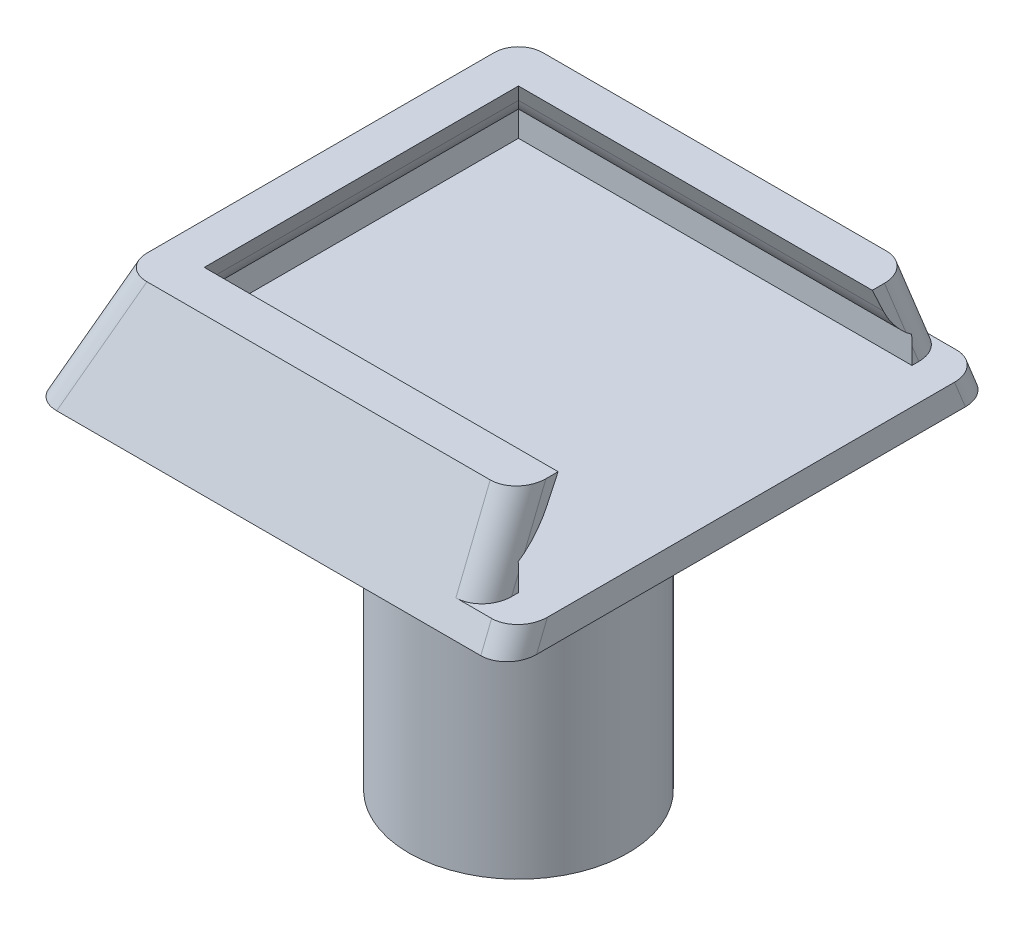
ISO-10303-21;
HEADER;
FILE_DESCRIPTION(('STEP AP214'),'2;1');
FILE_NAME('part.step','',(''),(''),'','','');
FILE_SCHEMA(('AUTOMOTIVE_DESIGN { 1 0 10303 214 1 1 1 1 }'));
ENDSEC;
DATA;
#1=APPLICATION_CONTEXT('core data for automotive mechanical design processes');
#2=APPLICATION_PROTOCOL_DEFINITION('international standard','automotive_design',2000,#1);
#3=PRODUCT_CONTEXT('',#1,'mechanical');
#4=PRODUCT('Part','Part','',(#3));
#5=PRODUCT_RELATED_PRODUCT_CATEGORY('part','',(#4));
#6=PRODUCT_DEFINITION_FORMATION('','',#4);
#7=PRODUCT_DEFINITION_CONTEXT('part definition',#1,'design');
#8=PRODUCT_DEFINITION('design','',#6,#7);
#9=PRODUCT_DEFINITION_SHAPE('','',#8);
#10=(LENGTH_UNIT() NAMED_UNIT(*) SI_UNIT(.MILLI.,.METRE.));
#11=(NAMED_UNIT(*) PLANE_ANGLE_UNIT() SI_UNIT($,.RADIAN.));
#12=(NAMED_UNIT(*) SI_UNIT($,.STERADIAN.) SOLID_ANGLE_UNIT());
#13=UNCERTAINTY_MEASURE_WITH_UNIT(LENGTH_MEASURE(1.E-05),#10,'distance_accuracy_value','');
#14=(GEOMETRIC_REPRESENTATION_CONTEXT(3) GLOBAL_UNCERTAINTY_ASSIGNED_CONTEXT((#13)) GLOBAL_UNIT_ASSIGNED_CONTEXT((#10,
#11,#12)) REPRESENTATION_CONTEXT('',''));
#15=CARTESIAN_POINT('',(0.,0.,0.));
#16=DIRECTION('',(0.,0.,1.));
#17=DIRECTION('',(1.,0.,0.));
#18=AXIS2_PLACEMENT_3D('',#15,#16,#17);
#19=CARTESIAN_POINT('',(48.,12.5,-4.));
#20=DIRECTION('',(-1.,0.,0.));
#21=DIRECTION('',(0.,0.,1.));
#22=AXIS2_PLACEMENT_3D('',#19,#20,#21);
#23=PLANE('',#22);
#24=DIRECTION('',(0.,0.,-1.));
#25=VECTOR('',#24,1.);
#26=CARTESIAN_POINT('',(48.,3.,-4.));
#27=LINE('',#26,#25);
#28=CARTESIAN_POINT('',(48.,3.,-3.23560422803275));
#29=VERTEX_POINT('',#28);
#30=CARTESIAN_POINT('',(48.,3.,-4.));
#31=VERTEX_POINT('',#30);
#32=EDGE_CURVE('E202',#29,#31,#27,.T.);
#33=ORIENTED_EDGE('',*,*,#32,.T.);
#34=DIRECTION('',(0.,1.,0.));
#35=VECTOR('',#34,1.);
#36=CARTESIAN_POINT('',(48.,12.5,-4.));
#37=LINE('',#36,#35);
#38=CARTESIAN_POINT('',(48.,4.89194592600314,-4.));
#39=VERTEX_POINT('',#38);
#40=EDGE_CURVE('E196',#31,#39,#37,.T.);
#41=ORIENTED_EDGE('',*,*,#40,.T.);
#42=DIRECTION('',(0.,0.927183854566787,-0.374606593415913));
#43=VECTOR('',#42,1.);
#44=CARTESIAN_POINT('',(48.,11.4323610122788,-6.64249922270331));
#45=LINE('',#44,#43);
#46=EDGE_CURVE('E312',#39,#29,#45,.F.);
#47=ORIENTED_EDGE('',*,*,#46,.T.);
#48=EDGE_LOOP('',(#33,#41,#47));
#49=FACE_BOUND('',#48,.T.);
#50=ADVANCED_FACE('F39',(#49),#23,.F.);
#51=CARTESIAN_POINT('',(48.,12.5,-52.));
#52=DIRECTION('',(-1.,0.,0.));
#53=DIRECTION('',(0.,0.,1.));
#54=AXIS2_PLACEMENT_3D('',#51,#52,#53);
#55=PLANE('',#54);
#56=DIRECTION('',(0.,0.90630778703665,0.4226182617407));
#57=VECTOR('',#56,1.);
#58=CARTESIAN_POINT('',(48.,9.2711522597731,-45.0757136758118));
#59=LINE('',#58,#57);
#60=CARTESIAN_POINT('',(48.,12.5,-43.5700772475275));
#61=VERTEX_POINT('',#60);
#62=CARTESIAN_POINT('',(48.,9.88094574156506,-44.7913623053592));
#63=VERTEX_POINT('',#62);
#64=EDGE_CURVE('E251',#61,#63,#59,.F.);
#65=ORIENTED_EDGE('',*,*,#64,.T.);
#66=CARTESIAN_POINT('',(48.,14.1071283589721,-53.8544401757257));
#67=DIRECTION('',(-1.,0.,0.));
#68=DIRECTION('',(0.,0.,1.));
#69=AXIS2_PLACEMENT_3D('',#66,#67,#68);
#70=CIRCLE('',#69,10.);
#71=CARTESIAN_POINT('',(48.,6.51732564207658,-47.3433039677658));
#72=VERTEX_POINT('',#71);
#73=EDGE_CURVE('E352',#63,#72,#70,.F.);
#74=ORIENTED_EDGE('',*,*,#73,.T.);
#75=DIRECTION('',(0.,0.927183854566787,0.374606593415913));
#76=VECTOR('',#75,1.);
#77=CARTESIAN_POINT('',(48.,10.0430442713609,-45.9188211766194));
#78=LINE('',#77,#76);
#79=CARTESIAN_POINT('',(48.,12.5,-44.9261466265332));
#80=VERTEX_POINT('',#79);
#81=EDGE_CURVE('E308',#72,#80,#78,.T.);
#82=ORIENTED_EDGE('',*,*,#81,.T.);
#83=DIRECTION('',(0.,0.,-1.));
#84=VECTOR('',#83,1.);
#85=CARTESIAN_POINT('',(48.,12.5,-52.));
#86=LINE('',#85,#84);
#87=EDGE_CURVE('E252',#61,#80,#86,.T.);
#88=ORIENTED_EDGE('',*,*,#87,.F.);
#89=EDGE_LOOP('',(#65,#74,#82,#88));
#90=FACE_BOUND('',#89,.T.);
#91=ADVANCED_FACE('F384',(#90),#55,.F.);
#92=CARTESIAN_POINT('',(0.,3.,0.));
#93=DIRECTION('',(0.,-1.,0.));
#94=DIRECTION('',(0.,0.,-1.));
#95=AXIS2_PLACEMENT_3D('',#92,#93,#94);
#96=PLANE('',#95);
#97=DIRECTION('',(0.,0.,-1.));
#98=VECTOR('',#97,1.);
#99=CARTESIAN_POINT('',(48.,3.,-52.));
#100=LINE('',#99,#98);
#101=CARTESIAN_POINT('',(48.,3.,-48.));
#102=VERTEX_POINT('',#101);
#103=CARTESIAN_POINT('',(48.,3.,-48.7643957719673));
#104=VERTEX_POINT('',#103);
#105=EDGE_CURVE('E218',#102,#104,#100,.T.);
#106=ORIENTED_EDGE('',*,*,#105,.F.);
#107=DIRECTION('',(1.,0.,0.));
#108=VECTOR('',#107,1.);
#109=CARTESIAN_POINT('',(4.,3.,-48.));
#110=LINE('',#109,#108);
#111=CARTESIAN_POINT('',(4.,3.,-48.));
#112=VERTEX_POINT('',#111);
#113=EDGE_CURVE('E216',#112,#102,#110,.T.);
#114=ORIENTED_EDGE('',*,*,#113,.F.);
#115=DIRECTION('',(0.,0.,-1.));
#116=VECTOR('',#115,1.);
#117=CARTESIAN_POINT('',(4.,3.,-48.));
#118=LINE('',#117,#116);
#119=CARTESIAN_POINT('',(4.,3.,-4.));
#120=VERTEX_POINT('',#119);
#121=EDGE_CURVE('E201',#120,#112,#118,.T.);
#122=ORIENTED_EDGE('',*,*,#121,.F.);
#123=DIRECTION('',(-1.,0.,0.));
#124=VECTOR('',#123,1.);
#125=CARTESIAN_POINT('',(4.,3.,-4.));
#126=LINE('',#125,#124);
#127=EDGE_CURVE('E190',#31,#120,#126,.T.);
#128=ORIENTED_EDGE('',*,*,#127,.F.);
#129=ORIENTED_EDGE('',*,*,#32,.F.);
#130=CARTESIAN_POINT('',(45.,3.,-3.23560422803275));
#131=DIRECTION('',(0.,-1.,0.));
#132=DIRECTION('',(0.,0.,-1.));
#133=AXIS2_PLACEMENT_3D('',#130,#131,#132);
#134=ELLIPSE('',#133,3.23560422803275,3.);
#135=CARTESIAN_POINT('',(45.,3.,0.));
#136=VERTEX_POINT('',#135);
#137=EDGE_CURVE('E322',#29,#136,#134,.T.);
#138=ORIENTED_EDGE('',*,*,#137,.T.);
#139=DIRECTION('',(-1.,0.,0.));
#140=VECTOR('',#139,1.);
#141=CARTESIAN_POINT('',(0.,3.,0.));
#142=LINE('',#141,#140);
#143=CARTESIAN_POINT('',(49.,3.,0.));
#144=VERTEX_POINT('',#143);
#145=EDGE_CURVE('E236',#136,#144,#142,.F.);
#146=ORIENTED_EDGE('',*,*,#145,.T.);
#147=CARTESIAN_POINT('',(49.,3.,-3.23560422803275));
#148=DIRECTION('',(0.,-1.,0.));
#149=DIRECTION('',(0.,0.,-1.));
#150=AXIS2_PLACEMENT_3D('',#147,#148,#149);
#151=ELLIPSE('',#150,3.23560422803275,3.);
#152=CARTESIAN_POINT('',(52.,3.,-3.23560422803275));
#153=VERTEX_POINT('',#152);
#154=EDGE_CURVE('E338',#144,#153,#151,.F.);
#155=ORIENTED_EDGE('',*,*,#154,.T.);
#156=DIRECTION('',(0.,0.,-1.));
#157=VECTOR('',#156,1.);
#158=CARTESIAN_POINT('',(52.,3.,0.));
#159=LINE('',#158,#157);
#160=CARTESIAN_POINT('',(52.,3.,-48.7643957719672));
#161=VERTEX_POINT('',#160);
#162=EDGE_CURVE('E233',#153,#161,#159,.T.);
#163=ORIENTED_EDGE('',*,*,#162,.T.);
#164=CARTESIAN_POINT('',(49.,3.,-48.7643957719672));
#165=DIRECTION('',(0.,-1.,0.));
#166=DIRECTION('',(0.,0.,1.));
#167=AXIS2_PLACEMENT_3D('',#164,#165,#166);
#168=ELLIPSE('',#167,3.23560422803275,3.);
#169=CARTESIAN_POINT('',(49.,3.,-52.));
#170=VERTEX_POINT('',#169);
#171=EDGE_CURVE('E340',#161,#170,#168,.F.);
#172=ORIENTED_EDGE('',*,*,#171,.T.);
#173=DIRECTION('',(1.,0.,0.));
#174=VECTOR('',#173,1.);
#175=CARTESIAN_POINT('',(0.,3.,-52.));
#176=LINE('',#175,#174);
#177=CARTESIAN_POINT('',(45.,3.,-52.));
#178=VERTEX_POINT('',#177);
#179=EDGE_CURVE('E235',#170,#178,#176,.F.);
#180=ORIENTED_EDGE('',*,*,#179,.T.);
#181=CARTESIAN_POINT('',(45.,3.,-48.7643957719673));
#182=DIRECTION('',(0.,-1.,0.));
#183=DIRECTION('',(0.,0.,1.));
#184=AXIS2_PLACEMENT_3D('',#181,#182,#183);
#185=ELLIPSE('',#184,3.23560422803275,3.);
#186=EDGE_CURVE('E320',#178,#104,#185,.T.);
#187=ORIENTED_EDGE('',*,*,#186,.T.);
#188=EDGE_LOOP('',(#106,#114,#122,#128,#129,#138,#146,#155,#163,#172,#180,#187));
#189=FACE_BOUND('',#188,.T.);
#190=ADVANCED_FACE('F215',(#189),#96,.F.);
#191=CARTESIAN_POINT('',(0.,3.,0.));
#192=DIRECTION('',(-0.927183854566787,0.374606593415913,0.));
#193=DIRECTION('',(-0.374606593415913,-0.927183854566787,0.));
#194=AXIS2_PLACEMENT_3D('',#191,#192,#193);
#195=PLANE('',#194);
#196=DIRECTION('',(0.,0.,-1.));
#197=VECTOR('',#196,1.);
#198=CARTESIAN_POINT('',(3.838249145434,12.5,0.));
#199=LINE('',#198,#197);
#200=CARTESIAN_POINT('',(3.838249145434,12.5,-45.3801992908656));
#201=VERTEX_POINT('',#200);
#202=CARTESIAN_POINT('',(3.838249145434,12.5,-6.61980070913436));
#203=VERTEX_POINT('',#202);
#204=EDGE_CURVE('E224',#201,#203,#199,.F.);
#205=ORIENTED_EDGE('',*,*,#204,.F.);
#206=DIRECTION('',(0.350800434887317,0.868261544562316,0.350800434887317));
#207=VECTOR('',#206,1.);
#208=CARTESIAN_POINT('',(6.05686878176981,17.991276294626,-43.1615796545298));
#209=LINE('',#208,#207);
#210=CARTESIAN_POINT('',(-1.21207867750547,0.,-50.4305271138051));
#211=VERTEX_POINT('',#210);
#212=EDGE_CURVE('E287',#201,#211,#209,.F.);
#213=ORIENTED_EDGE('',*,*,#212,.T.);
#214=DIRECTION('',(0.,0.,-1.));
#215=VECTOR('',#214,1.);
#216=CARTESIAN_POINT('',(-1.21207867750547,0.,0.));
#217=LINE('',#216,#215);
#218=CARTESIAN_POINT('',(-1.21207867750547,0.,-1.56947288619489));
#219=VERTEX_POINT('',#218);
#220=EDGE_CURVE('E232',#211,#219,#217,.F.);
#221=ORIENTED_EDGE('',*,*,#220,.T.);
#222=DIRECTION('',(0.350800434887317,0.868261544562316,-0.350800434887317));
#223=VECTOR('',#222,1.);
#224=CARTESIAN_POINT('',(-0.342300364321,2.15277686834949,-2.43925119937936));
#225=LINE('',#224,#223);
#226=EDGE_CURVE('E285',#219,#203,#225,.T.);
#227=ORIENTED_EDGE('',*,*,#226,.T.);
#228=EDGE_LOOP('',(#205,#213,#221,#227));
#229=FACE_BOUND('',#228,.T.);
#230=ADVANCED_FACE('F512',(#229),#195,.T.);
#231=CARTESIAN_POINT('',(0.,3.,0.));
#232=DIRECTION('',(0.,0.374606593415913,0.927183854566787));
#233=DIRECTION('',(0.,-0.927183854566787,0.374606593415913));
#234=AXIS2_PLACEMENT_3D('',#231,#232,#233);
#235=PLANE('',#234);
#236=DIRECTION('',(-1.,0.,0.));
#237=VECTOR('',#236,1.);
#238=CARTESIAN_POINT('',(0.,0.,1.21207867750547));
#239=LINE('',#238,#237);
#240=CARTESIAN_POINT('',(1.56947288619489,0.,1.21207867750547));
#241=VERTEX_POINT('',#240);
#242=CARTESIAN_POINT('',(49.,0.,1.21207867750547));
#243=VERTEX_POINT('',#242);
#244=EDGE_CURVE('E241',#241,#243,#239,.F.);
#245=ORIENTED_EDGE('',*,*,#244,.T.);
#246=DIRECTION('',(0.,-0.927183854566787,0.374606593415913));
#247=VECTOR('',#246,1.);
#248=CARTESIAN_POINT('',(49.,3.,0.));
#249=LINE('',#248,#247);
#250=EDGE_CURVE('E342',#243,#144,#249,.F.);
#251=ORIENTED_EDGE('',*,*,#250,.T.);
#252=ORIENTED_EDGE('',*,*,#145,.F.);
#253=DIRECTION('',(0.,-0.927183854566787,0.374606593415913));
#254=VECTOR('',#253,1.);
#255=CARTESIAN_POINT('',(45.,3.,0.));
#256=LINE('',#255,#254);
#257=CARTESIAN_POINT('',(45.,12.5,-3.838249145434));
#258=VERTEX_POINT('',#257);
#259=EDGE_CURVE('E318',#136,#258,#256,.F.);
#260=ORIENTED_EDGE('',*,*,#259,.T.);
#261=DIRECTION('',(-1.,0.,0.));
#262=VECTOR('',#261,1.);
#263=CARTESIAN_POINT('',(0.,12.5,-3.838249145434));
#264=LINE('',#263,#262);
#265=CARTESIAN_POINT('',(6.61980070913436,12.5,-3.838249145434));
#266=VERTEX_POINT('',#265);
#267=EDGE_CURVE('E255',#266,#258,#264,.F.);
#268=ORIENTED_EDGE('',*,*,#267,.F.);
#269=DIRECTION('',(0.350800434887317,0.868261544562316,-0.350800434887317));
#270=VECTOR('',#269,1.);
#271=CARTESIAN_POINT('',(2.43925119937936,2.15277686834949,0.342300364321));
#272=LINE('',#271,#270);
#273=EDGE_CURVE('E315',#266,#241,#272,.F.);
#274=ORIENTED_EDGE('',*,*,#273,.T.);
#275=EDGE_LOOP('',(#245,#251,#252,#260,#268,#274));
#276=FACE_BOUND('',#275,.T.);
#277=ADVANCED_FACE('F494',(#276),#235,.T.);
#278=CARTESIAN_POINT('',(52.,3.,0.));
#279=DIRECTION('',(-1.,0.,0.));
#280=DIRECTION('',(0.,0.,1.));
#281=AXIS2_PLACEMENT_3D('',#278,#279,#280);
#282=PLANE('',#281);
#283=DIRECTION('',(0.,0.,-1.));
#284=VECTOR('',#283,1.);
#285=CARTESIAN_POINT('',(52.,0.,0.));
#286=LINE('',#285,#284);
#287=CARTESIAN_POINT('',(52.,0.,-2.02352555052728));
#288=VERTEX_POINT('',#287);
#289=CARTESIAN_POINT('',(52.,0.,-49.9764744494727));
#290=VERTEX_POINT('',#289);
#291=EDGE_CURVE('E237',#288,#290,#286,.T.);
#292=ORIENTED_EDGE('',*,*,#291,.T.);
#293=DIRECTION('',(0.,0.927183854566787,0.374606593415913));
#294=VECTOR('',#293,1.);
#295=CARTESIAN_POINT('',(52.,19.9372978516862,-41.9212832451045));
#296=LINE('',#295,#294);
#297=EDGE_CURVE('E335',#290,#161,#296,.T.);
#298=ORIENTED_EDGE('',*,*,#297,.T.);
#299=ORIENTED_EDGE('',*,*,#162,.F.);
#300=DIRECTION('',(0.,0.927183854566787,-0.374606593415913));
#301=VECTOR('',#300,1.);
#302=CARTESIAN_POINT('',(52.,1.87618021975226,-2.78155156370036));
#303=LINE('',#302,#301);
#304=EDGE_CURVE('E332',#153,#288,#303,.F.);
#305=ORIENTED_EDGE('',*,*,#304,.T.);
#306=EDGE_LOOP('',(#292,#298,#299,#305));
#307=FACE_BOUND('',#306,.T.);
#308=ADVANCED_FACE('F528',(#307),#282,.F.);
#309=CARTESIAN_POINT('',(0.,3.,-52.));
#310=DIRECTION('',(0.,0.374606593415913,-0.927183854566787));
#311=DIRECTION('',(0.,0.927183854566787,0.374606593415913));
#312=AXIS2_PLACEMENT_3D('',#309,#310,#311);
#313=PLANE('',#312);
#314=ORIENTED_EDGE('',*,*,#179,.F.);
#315=DIRECTION('',(0.,-0.927183854566787,-0.374606593415913));
#316=VECTOR('',#315,1.);
#317=CARTESIAN_POINT('',(49.,3.,-52.));
#318=LINE('',#317,#316);
#319=CARTESIAN_POINT('',(49.,0.,-53.2120786775055));
#320=VERTEX_POINT('',#319);
#321=EDGE_CURVE('E325',#170,#320,#318,.T.);
#322=ORIENTED_EDGE('',*,*,#321,.T.);
#323=DIRECTION('',(1.,0.,0.));
#324=VECTOR('',#323,1.);
#325=CARTESIAN_POINT('',(0.,0.,-53.2120786775055));
#326=LINE('',#325,#324);
#327=CARTESIAN_POINT('',(1.56947288619489,0.,-53.2120786775055));
#328=VERTEX_POINT('',#327);
#329=EDGE_CURVE('E240',#320,#328,#326,.F.);
#330=ORIENTED_EDGE('',*,*,#329,.T.);
#331=DIRECTION('',(0.350800434887317,0.868261544562316,0.350800434887317));
#332=VECTOR('',#331,1.);
#333=CARTESIAN_POINT('',(2.43925119937936,2.15277686834949,-52.342300364321));
#334=LINE('',#333,#332);
#335=CARTESIAN_POINT('',(6.61980070913436,12.5,-48.161750854566));
#336=VERTEX_POINT('',#335);
#337=EDGE_CURVE('E298',#328,#336,#334,.T.);
#338=ORIENTED_EDGE('',*,*,#337,.T.);
#339=DIRECTION('',(1.,0.,0.));
#340=VECTOR('',#339,1.);
#341=CARTESIAN_POINT('',(0.,12.5,-48.161750854566));
#342=LINE('',#341,#340);
#343=CARTESIAN_POINT('',(45.,12.5,-48.161750854566));
#344=VERTEX_POINT('',#343);
#345=EDGE_CURVE('E248',#344,#336,#342,.F.);
#346=ORIENTED_EDGE('',*,*,#345,.F.);
#347=DIRECTION('',(0.,-0.927183854566787,-0.374606593415913));
#348=VECTOR('',#347,1.);
#349=CARTESIAN_POINT('',(45.,2.99999999999997,-52.));
#350=LINE('',#349,#348);
#351=EDGE_CURVE('E295',#344,#178,#350,.T.);
#352=ORIENTED_EDGE('',*,*,#351,.T.);
#353=EDGE_LOOP('',(#314,#322,#330,#338,#346,#352));
#354=FACE_BOUND('',#353,.T.);
#355=ADVANCED_FACE('F445',(#354),#313,.T.);
#356=CARTESIAN_POINT('',(0.,0.,0.));
#357=DIRECTION('',(0.,-1.,0.));
#358=DIRECTION('',(0.,0.,-1.));
#359=AXIS2_PLACEMENT_3D('',#356,#357,#358);
#360=PLANE('',#359);
#361=CARTESIAN_POINT('',(26.,0.,-26.));
#362=DIRECTION('',(0.,-1.,0.));
#363=DIRECTION('',(0.,0.,-1.));
#364=AXIS2_PLACEMENT_3D('',#361,#362,#363);
#365=CIRCLE('',#364,14.25);
#366=CARTESIAN_POINT('',(26.,0.,-40.25));
#367=VERTEX_POINT('',#366);
#368=EDGE_CURVE('E282',#367,#367,#365,.F.);
#369=ORIENTED_EDGE('',*,*,#368,.T.);
#370=EDGE_LOOP('',(#369));
#371=FACE_BOUND('',#370,.T.);
#372=ORIENTED_EDGE('',*,*,#329,.F.);
#373=CARTESIAN_POINT('',(49.,0.,-49.9764744494727));
#374=DIRECTION('',(0.,-1.,0.));
#375=DIRECTION('',(0.,0.,1.));
#376=AXIS2_PLACEMENT_3D('',#373,#374,#375);
#377=ELLIPSE('',#376,3.23560422803275,3.);
#378=EDGE_CURVE('E330',#320,#290,#377,.T.);
#379=ORIENTED_EDGE('',*,*,#378,.T.);
#380=ORIENTED_EDGE('',*,*,#291,.F.);
#381=CARTESIAN_POINT('',(49.,0.,-2.02352555052728));
#382=DIRECTION('',(0.,-1.,0.));
#383=DIRECTION('',(0.,0.,-1.));
#384=AXIS2_PLACEMENT_3D('',#381,#382,#383);
#385=ELLIPSE('',#384,3.23560422803275,3.);
#386=EDGE_CURVE('E328',#288,#243,#385,.T.);
#387=ORIENTED_EDGE('',*,*,#386,.T.);
#388=ORIENTED_EDGE('',*,*,#244,.F.);
#389=CARTESIAN_POINT('',(2.02352555052728,0.,-2.02352555052728));
#390=DIRECTION('',(0.,-1.,0.));
#391=DIRECTION('',(-0.707106781186548,0.,0.707106781186548));
#392=AXIS2_PLACEMENT_3D('',#389,#390,#391);
#393=ELLIPSE('',#392,3.45518008806008,3.);
#394=EDGE_CURVE('E290',#241,#219,#393,.T.);
#395=ORIENTED_EDGE('',*,*,#394,.T.);
#396=ORIENTED_EDGE('',*,*,#220,.F.);
#397=CARTESIAN_POINT('',(2.02352555052728,0.,-49.9764744494727));
#398=DIRECTION('',(0.,-1.,0.));
#399=DIRECTION('',(-0.707106781186548,0.,-0.707106781186548));
#400=AXIS2_PLACEMENT_3D('',#397,#398,#399);
#401=ELLIPSE('',#400,3.45518008806008,3.);
#402=EDGE_CURVE('E292',#211,#328,#401,.T.);
#403=ORIENTED_EDGE('',*,*,#402,.T.);
#404=EDGE_LOOP('',(#372,#379,#380,#387,#388,#395,#396,#403));
#405=FACE_BOUND('',#404,.T.);
#406=ADVANCED_FACE('F410',(#371,#405),#360,.T.);
#407=CARTESIAN_POINT('',(26.,-38.1,-26.));
#408=DIRECTION('',(0.,-1.,0.));
#409=DIRECTION('',(0.,0.,-1.));
#410=AXIS2_PLACEMENT_3D('',#407,#408,#409);
#411=PLANE('',#410);
#412=CARTESIAN_POINT('',(26.,-38.1,-26.));
#413=DIRECTION('',(0.,-1.,0.));
#414=DIRECTION('',(0.,0.,-1.));
#415=AXIS2_PLACEMENT_3D('',#412,#413,#414);
#416=CIRCLE('',#415,12.25);
#417=CARTESIAN_POINT('',(26.,-38.1,-13.75));
#418=VERTEX_POINT('',#417);
#419=EDGE_CURVE('E228',#418,#418,#416,.T.);
#420=ORIENTED_EDGE('',*,*,#419,.T.);
#421=EDGE_LOOP('',(#420));
#422=FACE_BOUND('',#421,.T.);
#423=CARTESIAN_POINT('',(26.,-38.1,-26.));
#424=DIRECTION('',(0.,-1.,0.));
#425=DIRECTION('',(0.,0.,-1.));
#426=AXIS2_PLACEMENT_3D('',#423,#424,#425);
#427=CIRCLE('',#426,10.75);
#428=CARTESIAN_POINT('',(26.,-38.1,-15.25));
#429=VERTEX_POINT('',#428);
#430=EDGE_CURVE('E225',#429,#429,#427,.T.);
#431=ORIENTED_EDGE('',*,*,#430,.F.);
#432=EDGE_LOOP('',(#431));
#433=FACE_BOUND('',#432,.T.);
#434=ADVANCED_FACE('F530',(#422,#433),#411,.T.);
#435=CARTESIAN_POINT('',(26.,-38.1,-26.));
#436=DIRECTION('',(0.,1.,0.));
#437=DIRECTION('',(0.,0.,1.));
#438=AXIS2_PLACEMENT_3D('',#435,#436,#437);
#439=CYLINDRICAL_SURFACE('',#438,12.25);
#440=CARTESIAN_POINT('',(26.,-2.,-26.));
#441=DIRECTION('',(0.,-1.,0.));
#442=DIRECTION('',(0.,0.,-1.));
#443=AXIS2_PLACEMENT_3D('',#440,#441,#442);
#444=CIRCLE('',#443,12.25);
#445=CARTESIAN_POINT('',(26.,-2.,-13.75));
#446=VERTEX_POINT('',#445);
#447=EDGE_CURVE('E245',#446,#446,#444,.T.);
#448=CARTESIAN_POINT('',(26.,-2.,-13.75));
#449=CARTESIAN_POINT('',(26.,-2.37604166666667,-13.75));
#450=CARTESIAN_POINT('',(26.,-2.75208333333334,-13.75));
#451=CARTESIAN_POINT('',(26.,-3.50416666666667,-13.75));
#452=CARTESIAN_POINT('',(26.,-3.88020833333334,-13.75));
#453=CARTESIAN_POINT('',(26.,-4.63229166666667,-13.75));
#454=CARTESIAN_POINT('',(26.,-5.00833333333334,-13.75));
#455=CARTESIAN_POINT('',(26.,-5.76041666666667,-13.75));
#456=CARTESIAN_POINT('',(26.,-6.13645833333334,-13.75));
#457=CARTESIAN_POINT('',(26.,-6.88854166666667,-13.75));
#458=CARTESIAN_POINT('',(26.,-7.26458333333333,-13.75));
#459=CARTESIAN_POINT('',(26.,-8.01666666666667,-13.75));
#460=CARTESIAN_POINT('',(26.,-8.39270833333333,-13.75));
#461=CARTESIAN_POINT('',(26.,-9.14479166666666,-13.75));
#462=CARTESIAN_POINT('',(26.,-9.52083333333333,-13.75));
#463=CARTESIAN_POINT('',(26.,-10.2729166666667,-13.75));
#464=CARTESIAN_POINT('',(26.,-10.6489583333333,-13.75));
#465=CARTESIAN_POINT('',(26.,-11.4010416666667,-13.75));
#466=CARTESIAN_POINT('',(26.,-11.7770833333333,-13.75));
#467=CARTESIAN_POINT('',(26.,-12.5291666666667,-13.75));
#468=CARTESIAN_POINT('',(26.,-12.9052083333333,-13.75));
#469=CARTESIAN_POINT('',(26.,-13.6572916666667,-13.75));
#470=CARTESIAN_POINT('',(26.,-14.0333333333333,-13.75));
#471=CARTESIAN_POINT('',(26.,-14.7854166666667,-13.75));
#472=CARTESIAN_POINT('',(26.,-15.1614583333333,-13.75));
#473=CARTESIAN_POINT('',(26.,-15.9135416666667,-13.75));
#474=CARTESIAN_POINT('',(26.,-16.2895833333333,-13.75));
#475=CARTESIAN_POINT('',(26.,-17.0416666666667,-13.75));
#476=CARTESIAN_POINT('',(26.,-17.4177083333333,-13.75));
#477=CARTESIAN_POINT('',(26.,-18.1697916666667,-13.75));
#478=CARTESIAN_POINT('',(26.,-18.5458333333333,-13.75));
#479=CARTESIAN_POINT('',(26.,-19.2979166666667,-13.75));
#480=CARTESIAN_POINT('',(26.,-19.6739583333333,-13.75));
#481=CARTESIAN_POINT('',(26.,-20.4260416666667,-13.75));
#482=CARTESIAN_POINT('',(26.,-20.8020833333333,-13.75));
#483=CARTESIAN_POINT('',(26.,-21.5541666666667,-13.75));
#484=CARTESIAN_POINT('',(26.,-21.9302083333333,-13.75));
#485=CARTESIAN_POINT('',(26.,-22.6822916666667,-13.75));
#486=CARTESIAN_POINT('',(26.,-23.0583333333333,-13.75));
#487=CARTESIAN_POINT('',(26.,-23.8104166666667,-13.75));
#488=CARTESIAN_POINT('',(26.,-24.1864583333333,-13.75));
#489=CARTESIAN_POINT('',(26.,-24.9385416666667,-13.75));
#490=CARTESIAN_POINT('',(26.,-25.3145833333333,-13.75));
#491=CARTESIAN_POINT('',(26.,-26.0666666666667,-13.75));
#492=CARTESIAN_POINT('',(26.,-26.4427083333333,-13.75));
#493=CARTESIAN_POINT('',(26.,-27.1947916666667,-13.75));
#494=CARTESIAN_POINT('',(26.,-27.5708333333333,-13.75));
#495=CARTESIAN_POINT('',(26.,-28.3229166666667,-13.75));
#496=CARTESIAN_POINT('',(26.,-28.6989583333333,-13.75));
#497=CARTESIAN_POINT('',(26.,-29.4510416666667,-13.75));
#498=CARTESIAN_POINT('',(26.,-29.8270833333333,-13.75));
#499=CARTESIAN_POINT('',(26.,-30.5791666666667,-13.75));
#500=CARTESIAN_POINT('',(26.,-30.9552083333333,-13.75));
#501=CARTESIAN_POINT('',(26.,-31.7072916666667,-13.75));
#502=CARTESIAN_POINT('',(26.,-32.0833333333333,-13.75));
#503=CARTESIAN_POINT('',(26.,-32.8354166666667,-13.75));
#504=CARTESIAN_POINT('',(26.,-33.2114583333333,-13.75));
#505=CARTESIAN_POINT('',(26.,-33.9635416666667,-13.75));
#506=CARTESIAN_POINT('',(26.,-34.3395833333333,-13.75));
#507=CARTESIAN_POINT('',(26.,-35.0916666666667,-13.75));
#508=CARTESIAN_POINT('',(26.,-35.4677083333333,-13.75));
#509=CARTESIAN_POINT('',(26.,-36.2197916666667,-13.75));
#510=CARTESIAN_POINT('',(26.,-36.5958333333333,-13.75));
#511=CARTESIAN_POINT('',(26.,-37.3479166666667,-13.75));
#512=CARTESIAN_POINT('',(26.,-37.7239583333333,-13.75));
#513=CARTESIAN_POINT('',(26.,-38.1,-13.75));
#514=B_SPLINE_CURVE_WITH_KNOTS('',3,(#448,#449,#450,#451,#452,#453,#454,#455,#456,#457,#458,
#459,#460,#461,#462,#463,#464,#465,#466,#467,#468,#469,#470,#471,#472,#473,#474,#475,#476,#477,
#478,#479,#480,#481,#482,#483,#484,#485,#486,#487,#488,#489,#490,#491,#492,#493,#494,#495,#496,
#497,#498,#499,#500,#501,#502,#503,#504,#505,#506,#507,#508,#509,#510,#511,#512,#513),
.UNSPECIFIED.,.F.,.F.,(4,2,2,2,2,2,2,2,2,2,2,2,2,2,2,2,2,2,2,2,2,2,2,2,2,2,2,2,2,2,2,2,4),(0.,
1.128125,2.25625,3.384375,4.5125,5.640625,6.76875,7.89687499999999,9.025,10.153125,11.28125,
12.409375,13.5375,14.665625,15.79375,16.921875,18.05,19.178125,20.30625,21.434375,22.5625,
23.690625,24.81875,25.946875,27.075,28.203125,29.33125,30.459375,31.5875,32.715625,33.84375,
34.971875,36.1),.UNSPECIFIED.);
#515=EDGE_CURVE('BSEAM536',#446,#418,#514,.T.);
#516=ORIENTED_EDGE('',*,*,#447,.T.);
#517=ORIENTED_EDGE('',*,*,#419,.F.);
#518=ORIENTED_EDGE('',*,*,#515,.T.);
#519=ORIENTED_EDGE('',*,*,#515,.F.);
#520=EDGE_LOOP('',(#516,#518,#517,#519));
#521=FACE_BOUND('',#520,.T.);
#522=ADVANCED_FACE('F536',(#521),#439,.T.);
#523=CARTESIAN_POINT('',(26.,-38.1,-26.));
#524=DIRECTION('',(0.,1.,0.));
#525=DIRECTION('',(0.,0.,1.));
#526=AXIS2_PLACEMENT_3D('',#523,#524,#525);
#527=CYLINDRICAL_SURFACE('',#526,10.75);
#528=CARTESIAN_POINT('',(26.,0.,-26.));
#529=DIRECTION('',(0.,-1.,0.));
#530=DIRECTION('',(0.,0.,-1.));
#531=AXIS2_PLACEMENT_3D('',#528,#529,#530);
#532=CIRCLE('',#531,10.75);
#533=CARTESIAN_POINT('',(26.,0.,-15.25));
#534=VERTEX_POINT('',#533);
#535=EDGE_CURVE('E242',#534,#534,#532,.F.);
#536=CARTESIAN_POINT('',(26.,-38.1,-15.25));
#537=CARTESIAN_POINT('',(26.,-37.703125,-15.25));
#538=CARTESIAN_POINT('',(26.,-37.30625,-15.25));
#539=CARTESIAN_POINT('',(26.,-36.5125,-15.25));
#540=CARTESIAN_POINT('',(26.,-36.115625,-15.25));
#541=CARTESIAN_POINT('',(26.,-35.321875,-15.25));
#542=CARTESIAN_POINT('',(26.,-34.925,-15.25));
#543=CARTESIAN_POINT('',(26.,-34.13125,-15.25));
#544=CARTESIAN_POINT('',(26.,-33.734375,-15.25));
#545=CARTESIAN_POINT('',(26.,-32.940625,-15.25));
#546=CARTESIAN_POINT('',(26.,-32.54375,-15.25));
#547=CARTESIAN_POINT('',(26.,-31.75,-15.25));
#548=CARTESIAN_POINT('',(26.,-31.353125,-15.25));
#549=CARTESIAN_POINT('',(26.,-30.559375,-15.25));
#550=CARTESIAN_POINT('',(26.,-30.1625,-15.25));
#551=CARTESIAN_POINT('',(26.,-29.36875,-15.25));
#552=CARTESIAN_POINT('',(26.,-28.971875,-15.25));
#553=CARTESIAN_POINT('',(26.,-28.178125,-15.25));
#554=CARTESIAN_POINT('',(26.,-27.78125,-15.25));
#555=CARTESIAN_POINT('',(26.,-26.9875,-15.25));
#556=CARTESIAN_POINT('',(26.,-26.590625,-15.25));
#557=CARTESIAN_POINT('',(26.,-25.796875,-15.25));
#558=CARTESIAN_POINT('',(26.,-25.4,-15.25));
#559=CARTESIAN_POINT('',(26.,-24.60625,-15.25));
#560=CARTESIAN_POINT('',(26.,-24.209375,-15.25));
#561=CARTESIAN_POINT('',(26.,-23.415625,-15.25));
#562=CARTESIAN_POINT('',(26.,-23.01875,-15.25));
#563=CARTESIAN_POINT('',(26.,-22.225,-15.25));
#564=CARTESIAN_POINT('',(26.,-21.828125,-15.25));
#565=CARTESIAN_POINT('',(26.,-21.034375,-15.25));
#566=CARTESIAN_POINT('',(26.,-20.6375,-15.25));
#567=CARTESIAN_POINT('',(26.,-19.84375,-15.25));
#568=CARTESIAN_POINT('',(26.,-19.446875,-15.25));
#569=CARTESIAN_POINT('',(26.,-18.653125,-15.25));
#570=CARTESIAN_POINT('',(26.,-18.25625,-15.25));
#571=CARTESIAN_POINT('',(26.,-17.4625,-15.25));
#572=CARTESIAN_POINT('',(26.,-17.065625,-15.25));
#573=CARTESIAN_POINT('',(26.,-16.271875,-15.25));
#574=CARTESIAN_POINT('',(26.,-15.875,-15.25));
#575=CARTESIAN_POINT('',(26.,-15.08125,-15.25));
#576=CARTESIAN_POINT('',(26.,-14.684375,-15.25));
#577=CARTESIAN_POINT('',(26.,-13.890625,-15.25));
#578=CARTESIAN_POINT('',(26.,-13.49375,-15.25));
#579=CARTESIAN_POINT('',(26.,-12.7,-15.25));
#580=CARTESIAN_POINT('',(26.,-12.303125,-15.25));
#581=CARTESIAN_POINT('',(26.,-11.509375,-15.25));
#582=CARTESIAN_POINT('',(26.,-11.1125,-15.25));
#583=CARTESIAN_POINT('',(26.,-10.31875,-15.25));
#584=CARTESIAN_POINT('',(26.,-9.92187499999999,-15.25));
#585=CARTESIAN_POINT('',(26.,-9.128125,-15.25));
#586=CARTESIAN_POINT('',(26.,-8.73124999999999,-15.25));
#587=CARTESIAN_POINT('',(26.,-7.93749999999999,-15.25));
#588=CARTESIAN_POINT('',(26.,-7.54062499999999,-15.25));
#589=CARTESIAN_POINT('',(26.,-6.746875,-15.25));
#590=CARTESIAN_POINT('',(26.,-6.35,-15.25));
#591=CARTESIAN_POINT('',(26.,-5.55625,-15.25));
#592=CARTESIAN_POINT('',(26.,-5.159375,-15.25));
#593=CARTESIAN_POINT('',(26.,-4.365625,-15.25));
#594=CARTESIAN_POINT('',(26.,-3.96875,-15.25));
#595=CARTESIAN_POINT('',(26.,-3.175,-15.25));
#596=CARTESIAN_POINT('',(26.,-2.778125,-15.25));
#597=CARTESIAN_POINT('',(26.,-1.984375,-15.25));
#598=CARTESIAN_POINT('',(26.,-1.5875,-15.25));
#599=CARTESIAN_POINT('',(26.,-0.79375,-15.25));
#600=CARTESIAN_POINT('',(26.,-0.396875,-15.25));
#601=CARTESIAN_POINT('',(26.,0.,-15.25));
#602=B_SPLINE_CURVE_WITH_KNOTS('',3,(#536,#537,#538,#539,#540,#541,#542,#543,#544,#545,#546,
#547,#548,#549,#550,#551,#552,#553,#554,#555,#556,#557,#558,#559,#560,#561,#562,#563,#564,#565,
#566,#567,#568,#569,#570,#571,#572,#573,#574,#575,#576,#577,#578,#579,#580,#581,#582,#583,#584,
#585,#586,#587,#588,#589,#590,#591,#592,#593,#594,#595,#596,#597,#598,#599,#600,#601),
.UNSPECIFIED.,.F.,.F.,(4,2,2,2,2,2,2,2,2,2,2,2,2,2,2,2,2,2,2,2,2,2,2,2,2,2,2,2,2,2,2,2,4),(0.,
1.190625,2.38125,3.571875,4.7625,5.953125,7.14375,8.334375,9.52500000000001,10.715625,11.90625,
13.096875,14.2875,15.478125,16.66875,17.859375,19.05,20.240625,21.43125,22.621875,23.8125,
25.003125,26.19375,27.384375,28.575,29.765625,30.95625,32.146875,33.3375,34.528125,35.71875,
36.909375,38.1),.UNSPECIFIED.);
#603=EDGE_CURVE('BSEAM407',#429,#534,#602,.T.);
#604=ORIENTED_EDGE('',*,*,#430,.T.);
#605=ORIENTED_EDGE('',*,*,#535,.T.);
#606=ORIENTED_EDGE('',*,*,#603,.T.);
#607=ORIENTED_EDGE('',*,*,#603,.F.);
#608=EDGE_LOOP('',(#604,#606,#605,#607));
#609=FACE_BOUND('',#608,.T.);
#610=ADVANCED_FACE('F407',(#609),#527,.F.);
#611=ORIENTED_EDGE('',*,*,#535,.F.);
#612=EDGE_LOOP('',(#611));
#613=FACE_BOUND('',#612,.T.);
#614=ADVANCED_FACE('F399',(#613),#360,.T.);
#615=CARTESIAN_POINT('',(48.,12.5,-7.07385337346675));
#616=VERTEX_POINT('',#615);
#617=CARTESIAN_POINT('',(48.,6.51732564207657,-4.65669603223417));
#618=VERTEX_POINT('',#617);
#619=EDGE_CURVE('E313',#616,#618,#45,.F.);
#620=ORIENTED_EDGE('',*,*,#619,.T.);
#621=CARTESIAN_POINT('',(48.,14.1071283589721,1.85444017572567));
#622=DIRECTION('',(-1.,0.,0.));
#623=DIRECTION('',(0.,0.,1.));
#624=AXIS2_PLACEMENT_3D('',#621,#622,#623);
#625=CIRCLE('',#624,10.);
#626=CARTESIAN_POINT('',(48.,9.88094574156507,-7.20863769464083));
#627=VERTEX_POINT('',#626);
#628=EDGE_CURVE('E11',#618,#627,#625,.F.);
#629=ORIENTED_EDGE('',*,*,#628,.T.);
#630=DIRECTION('',(0.,0.90630778703665,-0.4226182617407));
#631=VECTOR('',#630,1.);
#632=CARTESIAN_POINT('',(48.,3.,-4.));
#633=LINE('',#632,#631);
#634=CARTESIAN_POINT('',(48.,12.5,-8.4299227524725));
#635=VERTEX_POINT('',#634);
#636=EDGE_CURVE('E229',#635,#627,#633,.F.);
#637=ORIENTED_EDGE('',*,*,#636,.F.);
#638=DIRECTION('',(0.,0.,-1.));
#639=VECTOR('',#638,1.);
#640=CARTESIAN_POINT('',(48.,12.5,-4.));
#641=LINE('',#640,#639);
#642=EDGE_CURVE('E258',#616,#635,#641,.T.);
#643=ORIENTED_EDGE('',*,*,#642,.F.);
#644=EDGE_LOOP('',(#620,#629,#637,#643));
#645=FACE_BOUND('',#644,.T.);
#646=ADVANCED_FACE('F387',(#645),#23,.F.);
#647=CARTESIAN_POINT('',(4.,3.,-4.));
#648=DIRECTION('',(0.,-0.4226182617407,-0.90630778703665));
#649=DIRECTION('',(0.,0.90630778703665,-0.4226182617407));
#650=AXIS2_PLACEMENT_3D('',#647,#648,#649);
#651=PLANE('',#650);
#652=ORIENTED_EDGE('',*,*,#636,.T.);
#653=DIRECTION('',(-1.,0.,0.));
#654=VECTOR('',#653,1.);
#655=CARTESIAN_POINT('',(4.,9.88094574156507,-7.20863769464083));
#656=LINE('',#655,#654);
#657=CARTESIAN_POINT('',(7.20863769464083,9.88094574156507,-7.20863769464083));
#658=VERTEX_POINT('',#657);
#659=EDGE_CURVE('E415',#627,#658,#656,.T.);
#660=ORIENTED_EDGE('',*,*,#659,.T.);
#661=DIRECTION('',(-0.389281620635026,-0.834817129478987,0.389281620635026));
#662=VECTOR('',#661,1.);
#663=CARTESIAN_POINT('',(4.,3.,-4.));
#664=LINE('',#663,#662);
#665=CARTESIAN_POINT('',(8.4299227524725,12.5,-8.4299227524725));
#666=VERTEX_POINT('',#665);
#667=EDGE_CURVE('E268',#666,#658,#664,.T.);
#668=ORIENTED_EDGE('',*,*,#667,.F.);
#669=DIRECTION('',(1.,0.,0.));
#670=VECTOR('',#669,1.);
#671=CARTESIAN_POINT('',(4.,12.5,-8.4299227524725));
#672=LINE('',#671,#670);
#673=EDGE_CURVE('E272',#635,#666,#672,.F.);
#674=ORIENTED_EDGE('',*,*,#673,.F.);
#675=EDGE_LOOP('',(#652,#660,#668,#674));
#676=FACE_BOUND('',#675,.T.);
#677=ADVANCED_FACE('F398',(#676),#651,.T.);
#678=CARTESIAN_POINT('',(4.,3.,-48.));
#679=DIRECTION('',(0.90630778703665,-0.4226182617407,0.));
#680=DIRECTION('',(0.4226182617407,0.90630778703665,0.));
#681=AXIS2_PLACEMENT_3D('',#678,#679,#680);
#682=PLANE('',#681);
#683=ORIENTED_EDGE('',*,*,#667,.T.);
#684=DIRECTION('',(0.,0.,-1.));
#685=VECTOR('',#684,1.);
#686=CARTESIAN_POINT('',(7.20863769464083,9.88094574156507,-48.));
#687=LINE('',#686,#685);
#688=CARTESIAN_POINT('',(7.20863769464083,9.88094574156507,-44.7913623053592));
#689=VERTEX_POINT('',#688);
#690=EDGE_CURVE('E362',#658,#689,#687,.T.);
#691=ORIENTED_EDGE('',*,*,#690,.T.);
#692=DIRECTION('',(-0.389281620635026,-0.834817129478987,-0.389281620635026));
#693=VECTOR('',#692,1.);
#694=CARTESIAN_POINT('',(4.,3.,-48.));
#695=LINE('',#694,#693);
#696=CARTESIAN_POINT('',(8.4299227524725,12.5,-43.5700772475275));
#697=VERTEX_POINT('',#696);
#698=EDGE_CURVE('E265',#697,#689,#695,.T.);
#699=ORIENTED_EDGE('',*,*,#698,.F.);
#700=DIRECTION('',(0.,0.,1.));
#701=VECTOR('',#700,1.);
#702=CARTESIAN_POINT('',(8.4299227524725,12.5,-48.));
#703=LINE('',#702,#701);
#704=EDGE_CURVE('E274',#666,#697,#703,.F.);
#705=ORIENTED_EDGE('',*,*,#704,.F.);
#706=EDGE_LOOP('',(#683,#691,#699,#705));
#707=FACE_BOUND('',#706,.T.);
#708=ADVANCED_FACE('F403',(#707),#682,.T.);
#709=CARTESIAN_POINT('',(4.,3.,-48.));
#710=DIRECTION('',(0.,-0.4226182617407,0.90630778703665));
#711=DIRECTION('',(0.,-0.90630778703665,-0.4226182617407));
#712=AXIS2_PLACEMENT_3D('',#709,#710,#711);
#713=PLANE('',#712);
#714=ORIENTED_EDGE('',*,*,#698,.T.);
#715=DIRECTION('',(1.,0.,0.));
#716=VECTOR('',#715,1.);
#717=CARTESIAN_POINT('',(4.,9.88094574156506,-44.7913623053592));
#718=LINE('',#717,#716);
#719=EDGE_CURVE('E349',#689,#63,#718,.T.);
#720=ORIENTED_EDGE('',*,*,#719,.T.);
#721=ORIENTED_EDGE('',*,*,#64,.F.);
#722=DIRECTION('',(-1.,0.,0.));
#723=VECTOR('',#722,1.);
#724=CARTESIAN_POINT('',(4.,12.5,-43.5700772475275));
#725=LINE('',#724,#723);
#726=EDGE_CURVE('E276',#697,#61,#725,.F.);
#727=ORIENTED_EDGE('',*,*,#726,.F.);
#728=EDGE_LOOP('',(#714,#720,#721,#727));
#729=FACE_BOUND('',#728,.T.);
#730=ADVANCED_FACE('F484',(#729),#713,.T.);
#731=CARTESIAN_POINT('',(48.,4.89194592600312,-48.));
#732=VERTEX_POINT('',#731);
#733=EDGE_CURVE('E309',#104,#732,#78,.T.);
#734=ORIENTED_EDGE('',*,*,#733,.T.);
#735=DIRECTION('',(0.,-1.,0.));
#736=VECTOR('',#735,1.);
#737=CARTESIAN_POINT('',(48.,12.5,-48.));
#738=LINE('',#737,#736);
#739=EDGE_CURVE('E456',#732,#102,#738,.T.);
#740=ORIENTED_EDGE('',*,*,#739,.T.);
#741=ORIENTED_EDGE('',*,*,#105,.T.);
#742=EDGE_LOOP('',(#734,#740,#741));
#743=FACE_BOUND('',#742,.T.);
#744=ADVANCED_FACE('F395',(#743),#55,.F.);
#745=CARTESIAN_POINT('',(0.,12.5,0.));
#746=DIRECTION('',(0.,1.,0.));
#747=DIRECTION('',(0.,0.,1.));
#748=AXIS2_PLACEMENT_3D('',#745,#746,#747);
#749=PLANE('',#748);
#750=ORIENTED_EDGE('',*,*,#345,.T.);
#751=CARTESIAN_POINT('',(7.07385337346675,12.5,-44.9261466265332));
#752=DIRECTION('',(0.,1.,0.));
#753=DIRECTION('',(-0.707106781186548,0.,-0.707106781186548));
#754=AXIS2_PLACEMENT_3D('',#751,#752,#753);
#755=ELLIPSE('',#754,3.45518008806008,3.);
#756=EDGE_CURVE('E306',#336,#201,#755,.T.);
#757=ORIENTED_EDGE('',*,*,#756,.T.);
#758=ORIENTED_EDGE('',*,*,#204,.T.);
#759=CARTESIAN_POINT('',(7.07385337346675,12.5,-7.07385337346675));
#760=DIRECTION('',(0.,1.,0.));
#761=DIRECTION('',(-0.707106781186548,0.,0.707106781186548));
#762=AXIS2_PLACEMENT_3D('',#759,#760,#761);
#763=ELLIPSE('',#762,3.45518008806008,3.);
#764=EDGE_CURVE('E300',#203,#266,#763,.T.);
#765=ORIENTED_EDGE('',*,*,#764,.T.);
#766=ORIENTED_EDGE('',*,*,#267,.T.);
#767=CARTESIAN_POINT('',(45.,12.5,-7.07385337346675));
#768=DIRECTION('',(0.,1.,0.));
#769=DIRECTION('',(0.,0.,-1.));
#770=AXIS2_PLACEMENT_3D('',#767,#768,#769);
#771=ELLIPSE('',#770,3.23560422803275,3.);
#772=EDGE_CURVE('E302',#258,#616,#771,.T.);
#773=ORIENTED_EDGE('',*,*,#772,.T.);
#774=ORIENTED_EDGE('',*,*,#642,.T.);
#775=ORIENTED_EDGE('',*,*,#673,.T.);
#776=ORIENTED_EDGE('',*,*,#704,.T.);
#777=ORIENTED_EDGE('',*,*,#726,.T.);
#778=ORIENTED_EDGE('',*,*,#87,.T.);
#779=CARTESIAN_POINT('',(45.,12.5,-44.9261466265332));
#780=DIRECTION('',(0.,1.,0.));
#781=DIRECTION('',(0.,0.,1.));
#782=AXIS2_PLACEMENT_3D('',#779,#780,#781);
#783=ELLIPSE('',#782,3.23560422803275,3.);
#784=EDGE_CURVE('E304',#80,#344,#783,.T.);
#785=ORIENTED_EDGE('',*,*,#784,.T.);
#786=EDGE_LOOP('',(#750,#757,#758,#765,#766,#773,#774,#775,#776,#777,#778,#785));
#787=FACE_BOUND('',#786,.T.);
#788=ADVANCED_FACE('F467',(#787),#749,.T.);
#789=CARTESIAN_POINT('',(26.,-2.,-26.));
#790=DIRECTION('',(0.,-1.,0.));
#791=DIRECTION('',(0.,0.,-1.));
#792=AXIS2_PLACEMENT_3D('',#789,#790,#791);
#793=TOROIDAL_SURFACE('',#792,14.25,2.);
#794=ORIENTED_EDGE('',*,*,#368,.F.);
#795=EDGE_LOOP('',(#794));
#796=FACE_BOUND('',#795,.T.);
#797=ORIENTED_EDGE('',*,*,#447,.F.);
#798=EDGE_LOOP('',(#797));
#799=FACE_BOUND('',#798,.T.);
#800=ADVANCED_FACE('F497',(#796,#799),#793,.F.);
#801=CARTESIAN_POINT('',(8.83842034547017,16.8674565143782,-43.1615796545298));
#802=DIRECTION('',(-0.350800434887317,-0.868261544562316,-0.350800434887317));
#803=DIRECTION('',(0.,0.374606593415913,-0.927183854566787));
#804=AXIS2_PLACEMENT_3D('',#801,#802,#803);
#805=CYLINDRICAL_SURFACE('',#804,3.);
#806=ORIENTED_EDGE('',*,*,#756,.F.);
#807=ORIENTED_EDGE('',*,*,#337,.F.);
#808=ORIENTED_EDGE('',*,*,#402,.F.);
#809=ORIENTED_EDGE('',*,*,#212,.F.);
#810=EDGE_LOOP('',(#806,#807,#808,#809));
#811=FACE_BOUND('',#810,.T.);
#812=ADVANCED_FACE('F499',(#811),#805,.T.);
#813=CARTESIAN_POINT('',(45.,1.87618021975223,-49.2184484362996));
#814=DIRECTION('',(0.,0.927183854566787,0.374606593415913));
#815=DIRECTION('',(0.,-0.374606593415913,0.927183854566787));
#816=AXIS2_PLACEMENT_3D('',#813,#814,#815);
#817=CYLINDRICAL_SURFACE('',#816,3.);
#818=ORIENTED_EDGE('',*,*,#81,.F.);
#819=CARTESIAN_POINT('',(48.,6.51732564207658,-47.3433039677658));
#820=CARTESIAN_POINT('',(47.9999990346602,6.4718980591921,-47.3962566944986));
#821=CARTESIAN_POINT('',(47.9994854220089,6.4270238587231,-47.4496869888446));
#822=CARTESIAN_POINT('',(47.9973017865364,6.33844934325357,-47.5574183731552));
#823=CARTESIAN_POINT('',(47.9956326657173,6.2947481402198,-47.6117187516481));
#824=CARTESIAN_POINT('',(47.9910072661734,6.20851502611157,-47.7211896532787));
#825=CARTESIAN_POINT('',(47.9880509644432,6.16598313595021,-47.7763601919515));
#826=CARTESIAN_POINT('',(47.9807075369092,6.08209282736522,-47.8875597146096));
#827=CARTESIAN_POINT('',(47.976319296247,6.04073535065989,-47.943589334949));
#828=CARTESIAN_POINT('',(47.9711453973912,6.,-48.));
#829=B_SPLINE_CURVE_WITH_KNOTS('',3,(#819,#820,#821,#822,#823,#824,#825,#826,#827,#828),
.UNSPECIFIED.,.F.,.F.,(4,2,2,2,4),(0.,0.209303190025788,0.418443179679268,0.627586907360371,
0.83689385721825),.UNSPECIFIED.);
#830=CARTESIAN_POINT('',(47.9711453973912,6.,-48.));
#831=VERTEX_POINT('',#830);
#832=EDGE_CURVE('E354',#72,#831,#829,.T.);
#833=ORIENTED_EDGE('',*,*,#832,.T.);
#834=CARTESIAN_POINT('',(45.,4.89194592600311,-48.));
#835=DIRECTION('',(0.,0.,-1.));
#836=DIRECTION('',(0.,1.,0.));
#837=AXIS2_PLACEMENT_3D('',#834,#835,#836);
#838=ELLIPSE('',#837,8.00840148766198,3.);
#839=EDGE_CURVE('E346',#732,#831,#838,.F.);
#840=ORIENTED_EDGE('',*,*,#839,.F.);
#841=ORIENTED_EDGE('',*,*,#733,.F.);
#842=ORIENTED_EDGE('',*,*,#186,.F.);
#843=ORIENTED_EDGE('',*,*,#351,.F.);
#844=ORIENTED_EDGE('',*,*,#784,.F.);
#845=EDGE_LOOP('',(#818,#833,#840,#841,#842,#843,#844));
#846=FACE_BOUND('',#845,.T.);
#847=ADVANCED_FACE('F364',(#846),#817,.T.);
#848=CARTESIAN_POINT('',(45.,11.4323610122788,-6.64249922270331));
#849=DIRECTION('',(0.,0.927183854566787,-0.374606593415913));
#850=DIRECTION('',(0.,0.374606593415913,0.927183854566787));
#851=AXIS2_PLACEMENT_3D('',#848,#849,#850);
#852=CYLINDRICAL_SURFACE('',#851,3.);
#853=CARTESIAN_POINT('',(45.,4.89194592600314,-4.));
#854=DIRECTION('',(0.,0.,1.));
#855=DIRECTION('',(0.,1.,0.));
#856=AXIS2_PLACEMENT_3D('',#853,#854,#855);
#857=ELLIPSE('',#856,8.00840148766203,3.);
#858=CARTESIAN_POINT('',(47.9711453973912,6.,-4.));
#859=VERTEX_POINT('',#858);
#860=EDGE_CURVE('E344',#859,#39,#857,.F.);
#861=ORIENTED_EDGE('',*,*,#860,.F.);
#862=CARTESIAN_POINT('',(47.9711453973912,6.,-4.));
#863=CARTESIAN_POINT('',(47.976319296247,6.04073535065989,-4.05641066505097));
#864=CARTESIAN_POINT('',(47.9807075369092,6.08209282736522,-4.11244028539046));
#865=CARTESIAN_POINT('',(47.9880509644432,6.16598313595021,-4.22363980804852));
#866=CARTESIAN_POINT('',(47.9910072661734,6.20851502611156,-4.27881034672132));
#867=CARTESIAN_POINT('',(47.9956326657173,6.29474814021979,-4.38828124835195));
#868=CARTESIAN_POINT('',(47.9973017865364,6.33844934325356,-4.44258162684483));
#869=CARTESIAN_POINT('',(47.9994854220089,6.42702385872309,-4.55031301115543));
#870=CARTESIAN_POINT('',(47.9999990346602,6.47189805919209,-4.60374330550139));
#871=CARTESIAN_POINT('',(48.,6.51732564207657,-4.65669603223417));
#872=B_SPLINE_CURVE_WITH_KNOTS('',3,(#862,#863,#864,#865,#866,#867,#868,#869,#870,#871),
.UNSPECIFIED.,.F.,.F.,(4,2,2,2,4),(0.,0.209306949857877,0.418450677538973,0.627590667192446,
0.836893857218225),.UNSPECIFIED.);
#873=EDGE_CURVE('E49',#859,#618,#872,.T.);
#874=ORIENTED_EDGE('',*,*,#873,.T.);
#875=ORIENTED_EDGE('',*,*,#619,.F.);
#876=ORIENTED_EDGE('',*,*,#772,.F.);
#877=ORIENTED_EDGE('',*,*,#259,.F.);
#878=ORIENTED_EDGE('',*,*,#137,.F.);
#879=ORIENTED_EDGE('',*,*,#46,.F.);
#880=EDGE_LOOP('',(#861,#874,#875,#876,#877,#878,#879));
#881=FACE_BOUND('',#880,.T.);
#882=ADVANCED_FACE('F423',(#881),#852,.T.);
#883=CARTESIAN_POINT('',(2.43925119937936,1.02895708810175,-2.43925119937936));
#884=DIRECTION('',(-0.350800434887317,-0.868261544562316,0.350800434887317));
#885=DIRECTION('',(0.,-0.374606593415913,-0.927183854566787));
#886=AXIS2_PLACEMENT_3D('',#883,#884,#885);
#887=CYLINDRICAL_SURFACE('',#886,3.);
#888=ORIENTED_EDGE('',*,*,#764,.F.);
#889=ORIENTED_EDGE('',*,*,#226,.F.);
#890=ORIENTED_EDGE('',*,*,#394,.F.);
#891=ORIENTED_EDGE('',*,*,#273,.F.);
#892=EDGE_LOOP('',(#888,#889,#890,#891));
#893=FACE_BOUND('',#892,.T.);
#894=ADVANCED_FACE('F427',(#893),#887,.T.);
#895=CARTESIAN_POINT('',(49.,1.87618021975226,-49.2184484362996));
#896=DIRECTION('',(0.,0.927183854566787,0.374606593415913));
#897=DIRECTION('',(0.,-0.374606593415913,0.927183854566787));
#898=AXIS2_PLACEMENT_3D('',#895,#896,#897);
#899=CYLINDRICAL_SURFACE('',#898,3.);
#900=ORIENTED_EDGE('',*,*,#171,.F.);
#901=ORIENTED_EDGE('',*,*,#297,.F.);
#902=ORIENTED_EDGE('',*,*,#378,.F.);
#903=ORIENTED_EDGE('',*,*,#321,.F.);
#904=EDGE_LOOP('',(#900,#901,#902,#903));
#905=FACE_BOUND('',#904,.T.);
#906=ADVANCED_FACE('F429',(#905),#899,.T.);
#907=CARTESIAN_POINT('',(49.,1.87618021975226,-2.78155156370036));
#908=DIRECTION('',(0.,0.927183854566787,-0.374606593415913));
#909=DIRECTION('',(0.,0.374606593415913,0.927183854566787));
#910=AXIS2_PLACEMENT_3D('',#907,#908,#909);
#911=CYLINDRICAL_SURFACE('',#910,3.);
#912=ORIENTED_EDGE('',*,*,#154,.F.);
#913=ORIENTED_EDGE('',*,*,#250,.F.);
#914=ORIENTED_EDGE('',*,*,#386,.F.);
#915=ORIENTED_EDGE('',*,*,#304,.F.);
#916=EDGE_LOOP('',(#912,#913,#914,#915));
#917=FACE_BOUND('',#916,.T.);
#918=ADVANCED_FACE('F374',(#917),#911,.T.);
#919=CARTESIAN_POINT('',(4.,3.,-48.));
#920=DIRECTION('',(0.,0.,-1.));
#921=DIRECTION('',(0.,1.,0.));
#922=AXIS2_PLACEMENT_3D('',#919,#920,#921);
#923=PLANE('',#922);
#924=ORIENTED_EDGE('',*,*,#839,.T.);
#925=DIRECTION('',(1.,0.,0.));
#926=VECTOR('',#925,1.);
#927=CARTESIAN_POINT('',(4.,6.,-48.));
#928=LINE('',#927,#926);
#929=CARTESIAN_POINT('',(4.,6.,-48.));
#930=VERTEX_POINT('',#929);
#931=EDGE_CURVE('E474',#930,#831,#928,.T.);
#932=ORIENTED_EDGE('',*,*,#931,.F.);
#933=DIRECTION('',(0.,1.,0.));
#934=VECTOR('',#933,1.);
#935=CARTESIAN_POINT('',(4.,3.,-48.));
#936=LINE('',#935,#934);
#937=EDGE_CURVE('E212',#112,#930,#936,.T.);
#938=ORIENTED_EDGE('',*,*,#937,.F.);
#939=ORIENTED_EDGE('',*,*,#113,.T.);
#940=ORIENTED_EDGE('',*,*,#739,.F.);
#941=EDGE_LOOP('',(#924,#932,#938,#939,#940));
#942=FACE_BOUND('',#941,.T.);
#943=ADVANCED_FACE('F436',(#942),#923,.F.);
#944=CARTESIAN_POINT('',(4.,3.,-4.));
#945=DIRECTION('',(0.,0.,1.));
#946=DIRECTION('',(1.,0.,0.));
#947=AXIS2_PLACEMENT_3D('',#944,#945,#946);
#948=PLANE('',#947);
#949=ORIENTED_EDGE('',*,*,#127,.T.);
#950=DIRECTION('',(0.,-1.,0.));
#951=VECTOR('',#950,1.);
#952=CARTESIAN_POINT('',(4.,3.,-4.));
#953=LINE('',#952,#951);
#954=CARTESIAN_POINT('',(4.,6.,-4.));
#955=VERTEX_POINT('',#954);
#956=EDGE_CURVE('E193',#955,#120,#953,.T.);
#957=ORIENTED_EDGE('',*,*,#956,.F.);
#958=DIRECTION('',(1.,0.,0.));
#959=VECTOR('',#958,1.);
#960=CARTESIAN_POINT('',(4.,6.,-4.));
#961=LINE('',#960,#959);
#962=EDGE_CURVE('E459',#955,#859,#961,.T.);
#963=ORIENTED_EDGE('',*,*,#962,.T.);
#964=ORIENTED_EDGE('',*,*,#860,.T.);
#965=ORIENTED_EDGE('',*,*,#40,.F.);
#966=EDGE_LOOP('',(#949,#957,#963,#964,#965));
#967=FACE_BOUND('',#966,.T.);
#968=ADVANCED_FACE('F192',(#967),#948,.F.);
#969=CARTESIAN_POINT('',(4.,0.,0.));
#970=DIRECTION('',(-1.,0.,0.));
#971=DIRECTION('',(0.,0.,1.));
#972=AXIS2_PLACEMENT_3D('',#969,#970,#971);
#973=PLANE('',#972);
#974=ORIENTED_EDGE('',*,*,#956,.T.);
#975=ORIENTED_EDGE('',*,*,#121,.T.);
#976=ORIENTED_EDGE('',*,*,#937,.T.);
#977=DIRECTION('',(0.,0.,1.));
#978=VECTOR('',#977,1.);
#979=CARTESIAN_POINT('',(4.,6.,-4.));
#980=LINE('',#979,#978);
#981=EDGE_CURVE('E210',#930,#955,#980,.T.);
#982=ORIENTED_EDGE('',*,*,#981,.T.);
#983=EDGE_LOOP('',(#974,#975,#976,#982));
#984=FACE_BOUND('',#983,.T.);
#985=ADVANCED_FACE('F206',(#984),#973,.F.);
#986=CARTESIAN_POINT('',(4.,14.1071283589721,1.85444017572567));
#987=DIRECTION('',(1.,0.,0.));
#988=DIRECTION('',(0.,0.,-1.));
#989=AXIS2_PLACEMENT_3D('',#986,#987,#988);
#990=CYLINDRICAL_SURFACE('',#989,10.);
#991=ORIENTED_EDGE('',*,*,#873,.F.);
#992=ORIENTED_EDGE('',*,*,#962,.F.);
#993=CARTESIAN_POINT('',(-1.85444017572567,14.1071283589721,1.85444017572567));
#994=DIRECTION('',(0.707106781186547,0.,0.707106781186547));
#995=DIRECTION('',(-0.707106781186547,0.,0.707106781186547));
#996=AXIS2_PLACEMENT_3D('',#993,#994,#995);
#997=ELLIPSE('',#996,14.1421356237309,10.);
#998=EDGE_CURVE('E44',#658,#955,#997,.F.);
#999=ORIENTED_EDGE('',*,*,#998,.F.);
#1000=ORIENTED_EDGE('',*,*,#659,.F.);
#1001=ORIENTED_EDGE('',*,*,#628,.F.);
#1002=EDGE_LOOP('',(#991,#992,#999,#1000,#1001));
#1003=FACE_BOUND('',#1002,.T.);
#1004=ADVANCED_FACE('F41',(#1003),#990,.T.);
#1005=CARTESIAN_POINT('',(-1.85444017572567,14.1071283589721,-4.));
#1006=DIRECTION('',(0.,0.,1.));
#1007=DIRECTION('',(1.,0.,0.));
#1008=AXIS2_PLACEMENT_3D('',#1005,#1006,#1007);
#1009=CYLINDRICAL_SURFACE('',#1008,10.);
#1010=ORIENTED_EDGE('',*,*,#998,.T.);
#1011=ORIENTED_EDGE('',*,*,#981,.F.);
#1012=CARTESIAN_POINT('',(-1.85444017572567,14.1071283589721,-53.8544401757257));
#1013=DIRECTION('',(-0.707106781186547,0.,0.707106781186547));
#1014=DIRECTION('',(0.707106781186547,0.,0.707106781186547));
#1015=AXIS2_PLACEMENT_3D('',#1012,#1013,#1014);
#1016=ELLIPSE('',#1015,14.1421356237309,10.);
#1017=EDGE_CURVE('E476',#689,#930,#1016,.F.);
#1018=ORIENTED_EDGE('',*,*,#1017,.F.);
#1019=ORIENTED_EDGE('',*,*,#690,.F.);
#1020=EDGE_LOOP('',(#1010,#1011,#1018,#1019));
#1021=FACE_BOUND('',#1020,.T.);
#1022=ADVANCED_FACE('F372',(#1021),#1009,.T.);
#1023=CARTESIAN_POINT('',(4.,14.1071283589721,-53.8544401757257));
#1024=DIRECTION('',(-1.,0.,0.));
#1025=DIRECTION('',(0.,0.,1.));
#1026=AXIS2_PLACEMENT_3D('',#1023,#1024,#1025);
#1027=CYLINDRICAL_SURFACE('',#1026,10.);
#1028=ORIENTED_EDGE('',*,*,#1017,.T.);
#1029=ORIENTED_EDGE('',*,*,#931,.T.);
#1030=ORIENTED_EDGE('',*,*,#832,.F.);
#1031=ORIENTED_EDGE('',*,*,#73,.F.);
#1032=ORIENTED_EDGE('',*,*,#719,.F.);
#1033=EDGE_LOOP('',(#1028,#1029,#1030,#1031,#1032));
#1034=FACE_BOUND('',#1033,.T.);
#1035=ADVANCED_FACE('F368',(#1034),#1027,.T.);
#1036=CLOSED_SHELL('',(#50,#91,#190,#230,#277,#308,#355,#406,#434,#522,#610,#614,#646,#677,#708,
#730,#744,#788,#800,#812,#847,#882,#894,#906,#918,#943,#968,#985,#1004,#1022,#1035));
#1037=MANIFOLD_SOLID_BREP('B2',#1036);
#1038=ADVANCED_BREP_SHAPE_REPRESENTATION('',(#18,#1037),#14);
#1039=SHAPE_DEFINITION_REPRESENTATION(#9,#1038);
ENDSEC;
END-ISO-10303-21;
